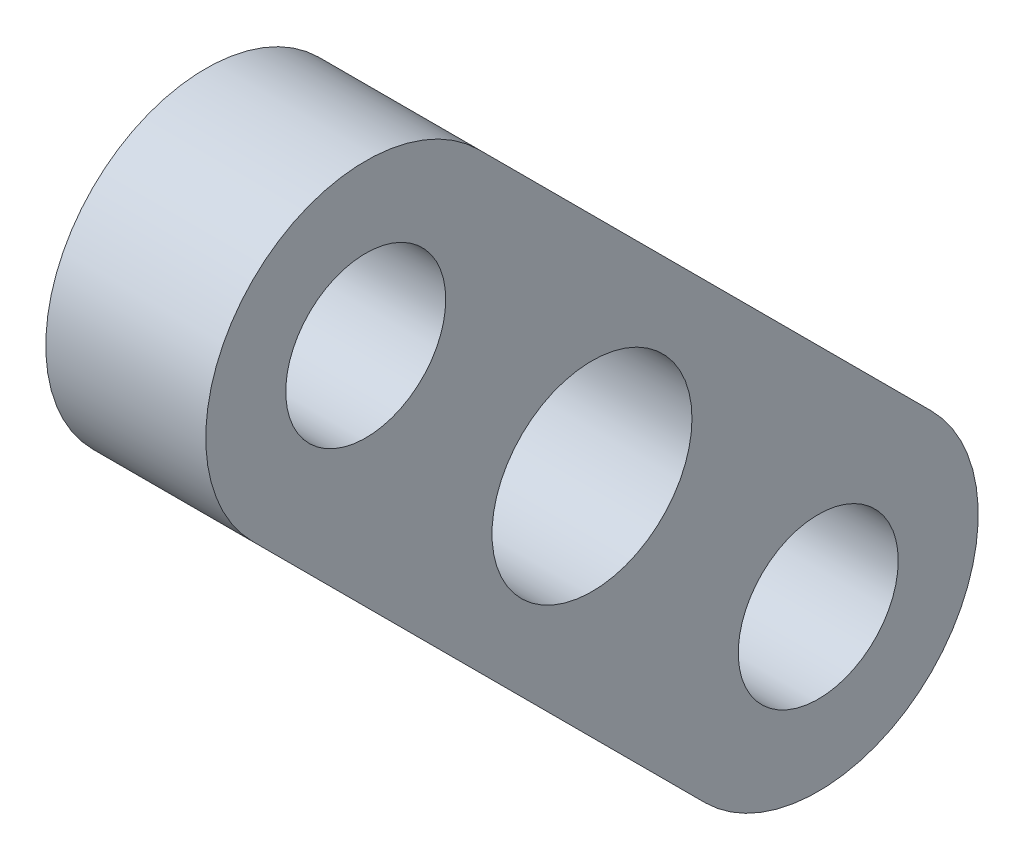
ISO-10303-21;
HEADER;
FILE_DESCRIPTION(('STEP AP214'),'2;1');
FILE_NAME('part.step','',(''),(''),'','','');
FILE_SCHEMA(('AUTOMOTIVE_DESIGN { 1 0 10303 214 1 1 1 1 }'));
ENDSEC;
DATA;
#1=APPLICATION_CONTEXT('core data for automotive mechanical design processes');
#2=APPLICATION_PROTOCOL_DEFINITION('international standard','automotive_design',2000,#1);
#3=PRODUCT_CONTEXT('',#1,'mechanical');
#4=PRODUCT('Part','Part','',(#3));
#5=PRODUCT_RELATED_PRODUCT_CATEGORY('part','',(#4));
#6=PRODUCT_DEFINITION_FORMATION('','',#4);
#7=PRODUCT_DEFINITION_CONTEXT('part definition',#1,'design');
#8=PRODUCT_DEFINITION('design','',#6,#7);
#9=PRODUCT_DEFINITION_SHAPE('','',#8);
#10=(LENGTH_UNIT() NAMED_UNIT(*) SI_UNIT(.MILLI.,.METRE.));
#11=(NAMED_UNIT(*) PLANE_ANGLE_UNIT() SI_UNIT($,.RADIAN.));
#12=(NAMED_UNIT(*) SI_UNIT($,.STERADIAN.) SOLID_ANGLE_UNIT());
#13=UNCERTAINTY_MEASURE_WITH_UNIT(LENGTH_MEASURE(1.E-05),#10,'distance_accuracy_value','');
#14=(GEOMETRIC_REPRESENTATION_CONTEXT(3) GLOBAL_UNCERTAINTY_ASSIGNED_CONTEXT((#13)) GLOBAL_UNIT_ASSIGNED_CONTEXT((#10,
#11,#12)) REPRESENTATION_CONTEXT('',''));
#15=CARTESIAN_POINT('',(0.,0.,0.));
#16=DIRECTION('',(0.,0.,1.));
#17=DIRECTION('',(1.,0.,0.));
#18=AXIS2_PLACEMENT_3D('',#15,#16,#17);
#19=CARTESIAN_POINT('',(2.,-1.41421356237309,1.4142135623731));
#20=DIRECTION('',(0.,0.707106781186544,-0.707106781186551));
#21=DIRECTION('',(0.,0.707106781186551,0.707106781186544));
#22=AXIS2_PLACEMENT_3D('',#19,#20,#21);
#23=PLANE('',#22);
#24=DIRECTION('',(0.,-0.707106781186551,-0.707106781186544));
#25=VECTOR('',#24,1.);
#26=CARTESIAN_POINT('',(0.,-1.41421356237309,1.4142135623731));
#27=LINE('',#26,#25);
#28=CARTESIAN_POINT('',(0.,1.41421356237312,4.24264068711928));
#29=VERTEX_POINT('',#28);
#30=CARTESIAN_POINT('',(0.,-4.24264068711929,-1.41421356237307));
#31=VERTEX_POINT('',#30);
#32=EDGE_CURVE('E113',#29,#31,#27,.T.);
#33=ORIENTED_EDGE('',*,*,#32,.T.);
#34=DIRECTION('',(-1.,0.,0.));
#35=VECTOR('',#34,1.);
#36=CARTESIAN_POINT('',(2.,-4.24264068711929,-1.41421356237307));
#37=LINE('',#36,#35);
#38=CARTESIAN_POINT('',(2.,-4.24264068711929,-1.41421356237307));
#39=VERTEX_POINT('',#38);
#40=EDGE_CURVE('E11',#39,#31,#37,.T.);
#41=ORIENTED_EDGE('',*,*,#40,.F.);
#42=DIRECTION('',(0.,-0.707106781186551,-0.707106781186544));
#43=VECTOR('',#42,1.);
#44=CARTESIAN_POINT('',(2.,-1.41421356237309,1.4142135623731));
#45=LINE('',#44,#43);
#46=CARTESIAN_POINT('',(2.,1.41421356237312,4.24264068711928));
#47=VERTEX_POINT('',#46);
#48=EDGE_CURVE('E89',#47,#39,#45,.T.);
#49=ORIENTED_EDGE('',*,*,#48,.F.);
#50=DIRECTION('',(-1.,0.,0.));
#51=VECTOR('',#50,1.);
#52=CARTESIAN_POINT('',(2.,1.41421356237312,4.24264068711928));
#53=LINE('',#52,#51);
#54=EDGE_CURVE('E112',#47,#29,#53,.T.);
#55=ORIENTED_EDGE('',*,*,#54,.T.);
#56=EDGE_LOOP('',(#33,#41,#49,#55));
#57=FACE_BOUND('',#56,.T.);
#58=ADVANCED_FACE('F41',(#57),#23,.F.);
#59=CARTESIAN_POINT('',(2.,-2.8284271247462,-2.82842712474617));
#60=DIRECTION('',(-1.,0.,0.));
#61=DIRECTION('',(0.,0.,1.));
#62=AXIS2_PLACEMENT_3D('',#59,#60,#61);
#63=CYLINDRICAL_SURFACE('',#62,2.);
#64=CARTESIAN_POINT('',(0.,-2.8284271247462,-2.82842712474617));
#65=DIRECTION('',(1.,0.,0.));
#66=DIRECTION('',(0.,0.,-1.));
#67=AXIS2_PLACEMENT_3D('',#64,#65,#66);
#68=CIRCLE('',#67,2.);
#69=CARTESIAN_POINT('',(0.,-1.41421356237312,-4.24264068711928));
#70=VERTEX_POINT('',#69);
#71=EDGE_CURVE('E94',#31,#70,#68,.T.);
#72=ORIENTED_EDGE('',*,*,#71,.T.);
#73=DIRECTION('',(-1.,0.,0.));
#74=VECTOR('',#73,1.);
#75=CARTESIAN_POINT('',(2.,-1.41421356237312,-4.24264068711928));
#76=LINE('',#75,#74);
#77=CARTESIAN_POINT('',(2.,-1.41421356237312,-4.24264068711928));
#78=VERTEX_POINT('',#77);
#79=EDGE_CURVE('E49',#78,#70,#76,.T.);
#80=ORIENTED_EDGE('',*,*,#79,.F.);
#81=CARTESIAN_POINT('',(2.,-2.8284271247462,-2.82842712474617));
#82=DIRECTION('',(1.,0.,0.));
#83=DIRECTION('',(0.,0.,-1.));
#84=AXIS2_PLACEMENT_3D('',#81,#82,#83);
#85=CIRCLE('',#84,2.);
#86=EDGE_CURVE('E83',#39,#78,#85,.T.);
#87=ORIENTED_EDGE('',*,*,#86,.F.);
#88=ORIENTED_EDGE('',*,*,#40,.T.);
#89=EDGE_LOOP('',(#72,#80,#87,#88));
#90=FACE_BOUND('',#89,.T.);
#91=ADVANCED_FACE('F93',(#90),#63,.T.);
#92=CARTESIAN_POINT('',(2.,1.41421356237309,-1.4142135623731));
#93=DIRECTION('',(0.,0.707106781186544,-0.707106781186551));
#94=DIRECTION('',(0.,0.707106781186551,0.707106781186544));
#95=AXIS2_PLACEMENT_3D('',#92,#93,#94);
#96=PLANE('',#95);
#97=DIRECTION('',(0.,-0.707106781186551,-0.707106781186544));
#98=VECTOR('',#97,1.);
#99=CARTESIAN_POINT('',(0.,1.41421356237309,-1.4142135623731));
#100=LINE('',#99,#98);
#101=CARTESIAN_POINT('',(0.,4.24264068711929,1.41421356237307));
#102=VERTEX_POINT('',#101);
#103=EDGE_CURVE('E117',#102,#70,#100,.T.);
#104=ORIENTED_EDGE('',*,*,#103,.F.);
#105=DIRECTION('',(-1.,0.,0.));
#106=VECTOR('',#105,1.);
#107=CARTESIAN_POINT('',(2.,4.24264068711929,1.41421356237307));
#108=LINE('',#107,#106);
#109=CARTESIAN_POINT('',(2.,4.24264068711929,1.41421356237307));
#110=VERTEX_POINT('',#109);
#111=EDGE_CURVE('E73',#110,#102,#108,.T.);
#112=ORIENTED_EDGE('',*,*,#111,.F.);
#113=DIRECTION('',(0.,-0.707106781186551,-0.707106781186544));
#114=VECTOR('',#113,1.);
#115=CARTESIAN_POINT('',(2.,1.41421356237309,-1.4142135623731));
#116=LINE('',#115,#114);
#117=EDGE_CURVE('E87',#110,#78,#116,.T.);
#118=ORIENTED_EDGE('',*,*,#117,.T.);
#119=ORIENTED_EDGE('',*,*,#79,.T.);
#120=EDGE_LOOP('',(#104,#112,#118,#119));
#121=FACE_BOUND('',#120,.T.);
#122=ADVANCED_FACE('F98',(#121),#96,.T.);
#123=CARTESIAN_POINT('',(2.,2.8284271247462,2.82842712474618));
#124=DIRECTION('',(-1.,0.,0.));
#125=DIRECTION('',(0.,0.,1.));
#126=AXIS2_PLACEMENT_3D('',#123,#124,#125);
#127=CYLINDRICAL_SURFACE('',#126,1.);
#128=CARTESIAN_POINT('',(2.,2.8284271247462,2.82842712474618));
#129=DIRECTION('',(1.,0.,0.));
#130=DIRECTION('',(0.,0.,-1.));
#131=AXIS2_PLACEMENT_3D('',#128,#129,#130);
#132=CIRCLE('',#131,1.);
#133=CARTESIAN_POINT('',(2.,2.8284271247462,1.82842712474617));
#134=VERTEX_POINT('',#133);
#135=EDGE_CURVE('E106',#134,#134,#132,.T.);
#136=ORIENTED_EDGE('',*,*,#135,.T.);
#137=EDGE_LOOP('',(#136));
#138=FACE_BOUND('',#137,.T.);
#139=CARTESIAN_POINT('',(0.,2.8284271247462,2.82842712474618));
#140=DIRECTION('',(1.,0.,0.));
#141=DIRECTION('',(0.,0.,-1.));
#142=AXIS2_PLACEMENT_3D('',#139,#140,#141);
#143=CIRCLE('',#142,1.);
#144=CARTESIAN_POINT('',(0.,2.8284271247462,1.82842712474617));
#145=VERTEX_POINT('',#144);
#146=EDGE_CURVE('E123',#145,#145,#143,.T.);
#147=ORIENTED_EDGE('',*,*,#146,.F.);
#148=EDGE_LOOP('',(#147));
#149=FACE_BOUND('',#148,.T.);
#150=ADVANCED_FACE('F163',(#138,#149),#127,.F.);
#151=CARTESIAN_POINT('',(2.,0.,0.));
#152=DIRECTION('',(-1.,0.,0.));
#153=DIRECTION('',(0.,0.,1.));
#154=AXIS2_PLACEMENT_3D('',#151,#152,#153);
#155=CYLINDRICAL_SURFACE('',#154,1.25);
#156=CARTESIAN_POINT('',(2.,0.,0.));
#157=DIRECTION('',(1.,0.,0.));
#158=DIRECTION('',(0.,0.,-1.));
#159=AXIS2_PLACEMENT_3D('',#156,#157,#158);
#160=CIRCLE('',#159,1.25);
#161=CARTESIAN_POINT('',(2.,0.,-1.25));
#162=VERTEX_POINT('',#161);
#163=EDGE_CURVE('E100',#162,#162,#160,.T.);
#164=ORIENTED_EDGE('',*,*,#163,.T.);
#165=EDGE_LOOP('',(#164));
#166=FACE_BOUND('',#165,.T.);
#167=CARTESIAN_POINT('',(0.,0.,0.));
#168=DIRECTION('',(1.,0.,0.));
#169=DIRECTION('',(0.,0.,-1.));
#170=AXIS2_PLACEMENT_3D('',#167,#168,#169);
#171=CIRCLE('',#170,1.25);
#172=CARTESIAN_POINT('',(0.,0.,-1.25));
#173=VERTEX_POINT('',#172);
#174=EDGE_CURVE('E120',#173,#173,#171,.T.);
#175=ORIENTED_EDGE('',*,*,#174,.F.);
#176=EDGE_LOOP('',(#175));
#177=FACE_BOUND('',#176,.T.);
#178=ADVANCED_FACE('F153',(#166,#177),#155,.F.);
#179=CARTESIAN_POINT('',(2.,2.8284271247462,2.82842712474618));
#180=DIRECTION('',(-1.,0.,0.));
#181=DIRECTION('',(0.,0.,1.));
#182=AXIS2_PLACEMENT_3D('',#179,#180,#181);
#183=CYLINDRICAL_SURFACE('',#182,2.);
#184=CARTESIAN_POINT('',(0.,2.8284271247462,2.82842712474618));
#185=DIRECTION('',(1.,0.,0.));
#186=DIRECTION('',(0.,0.,-1.));
#187=AXIS2_PLACEMENT_3D('',#184,#185,#186);
#188=CIRCLE('',#187,2.);
#189=EDGE_CURVE('E76',#102,#29,#188,.T.);
#190=ORIENTED_EDGE('',*,*,#189,.T.);
#191=ORIENTED_EDGE('',*,*,#54,.F.);
#192=CARTESIAN_POINT('',(2.,2.8284271247462,2.82842712474618));
#193=DIRECTION('',(1.,0.,0.));
#194=DIRECTION('',(0.,0.,-1.));
#195=AXIS2_PLACEMENT_3D('',#192,#193,#194);
#196=CIRCLE('',#195,2.);
#197=EDGE_CURVE('E57',#110,#47,#196,.T.);
#198=ORIENTED_EDGE('',*,*,#197,.F.);
#199=ORIENTED_EDGE('',*,*,#111,.T.);
#200=EDGE_LOOP('',(#190,#191,#198,#199));
#201=FACE_BOUND('',#200,.T.);
#202=ADVANCED_FACE('F145',(#201),#183,.T.);
#203=CARTESIAN_POINT('',(2.,-2.8284271247462,-2.82842712474617));
#204=DIRECTION('',(-1.,0.,0.));
#205=DIRECTION('',(0.,0.,1.));
#206=AXIS2_PLACEMENT_3D('',#203,#204,#205);
#207=CYLINDRICAL_SURFACE('',#206,1.);
#208=CARTESIAN_POINT('',(2.,-2.8284271247462,-2.82842712474617));
#209=DIRECTION('',(1.,0.,0.));
#210=DIRECTION('',(0.,0.,-1.));
#211=AXIS2_PLACEMENT_3D('',#208,#209,#210);
#212=CIRCLE('',#211,1.);
#213=CARTESIAN_POINT('',(2.,-2.8284271247462,-3.82842712474617));
#214=VERTEX_POINT('',#213);
#215=EDGE_CURVE('E109',#214,#214,#212,.T.);
#216=ORIENTED_EDGE('',*,*,#215,.T.);
#217=EDGE_LOOP('',(#216));
#218=FACE_BOUND('',#217,.T.);
#219=CARTESIAN_POINT('',(0.,-2.8284271247462,-2.82842712474617));
#220=DIRECTION('',(1.,0.,0.));
#221=DIRECTION('',(0.,0.,-1.));
#222=AXIS2_PLACEMENT_3D('',#219,#220,#221);
#223=CIRCLE('',#222,1.);
#224=CARTESIAN_POINT('',(0.,-2.8284271247462,-3.82842712474617));
#225=VERTEX_POINT('',#224);
#226=EDGE_CURVE('E126',#225,#225,#223,.T.);
#227=ORIENTED_EDGE('',*,*,#226,.F.);
#228=EDGE_LOOP('',(#227));
#229=FACE_BOUND('',#228,.T.);
#230=ADVANCED_FACE('F143',(#218,#229),#207,.F.);
#231=CARTESIAN_POINT('',(2.,0.,0.));
#232=DIRECTION('',(1.,0.,0.));
#233=DIRECTION('',(0.,0.,-1.));
#234=AXIS2_PLACEMENT_3D('',#231,#232,#233);
#235=PLANE('',#234);
#236=ORIENTED_EDGE('',*,*,#48,.T.);
#237=ORIENTED_EDGE('',*,*,#86,.T.);
#238=ORIENTED_EDGE('',*,*,#117,.F.);
#239=ORIENTED_EDGE('',*,*,#197,.T.);
#240=EDGE_LOOP('',(#236,#237,#238,#239));
#241=FACE_BOUND('',#240,.T.);
#242=ORIENTED_EDGE('',*,*,#163,.F.);
#243=EDGE_LOOP('',(#242));
#244=FACE_BOUND('',#243,.T.);
#245=ORIENTED_EDGE('',*,*,#135,.F.);
#246=EDGE_LOOP('',(#245));
#247=FACE_BOUND('',#246,.T.);
#248=ORIENTED_EDGE('',*,*,#215,.F.);
#249=EDGE_LOOP('',(#248));
#250=FACE_BOUND('',#249,.T.);
#251=ADVANCED_FACE('F84',(#241,#244,#247,#250),#235,.T.);
#252=CARTESIAN_POINT('',(0.,0.,0.));
#253=DIRECTION('',(1.,0.,0.));
#254=DIRECTION('',(0.,0.,-1.));
#255=AXIS2_PLACEMENT_3D('',#252,#253,#254);
#256=PLANE('',#255);
#257=ORIENTED_EDGE('',*,*,#32,.F.);
#258=ORIENTED_EDGE('',*,*,#189,.F.);
#259=ORIENTED_EDGE('',*,*,#103,.T.);
#260=ORIENTED_EDGE('',*,*,#71,.F.);
#261=EDGE_LOOP('',(#257,#258,#259,#260));
#262=FACE_BOUND('',#261,.T.);
#263=ORIENTED_EDGE('',*,*,#174,.T.);
#264=EDGE_LOOP('',(#263));
#265=FACE_BOUND('',#264,.T.);
#266=ORIENTED_EDGE('',*,*,#146,.T.);
#267=EDGE_LOOP('',(#266));
#268=FACE_BOUND('',#267,.T.);
#269=ORIENTED_EDGE('',*,*,#226,.T.);
#270=EDGE_LOOP('',(#269));
#271=FACE_BOUND('',#270,.T.);
#272=ADVANCED_FACE('F133',(#262,#265,#268,#271),#256,.F.);
#273=CLOSED_SHELL('',(#58,#91,#122,#150,#178,#202,#230,#251,#272));
#274=MANIFOLD_SOLID_BREP('B2',#273);
#275=ADVANCED_BREP_SHAPE_REPRESENTATION('',(#18,#274),#14);
#276=SHAPE_DEFINITION_REPRESENTATION(#9,#275);
ENDSEC;
END-ISO-10303-21;
